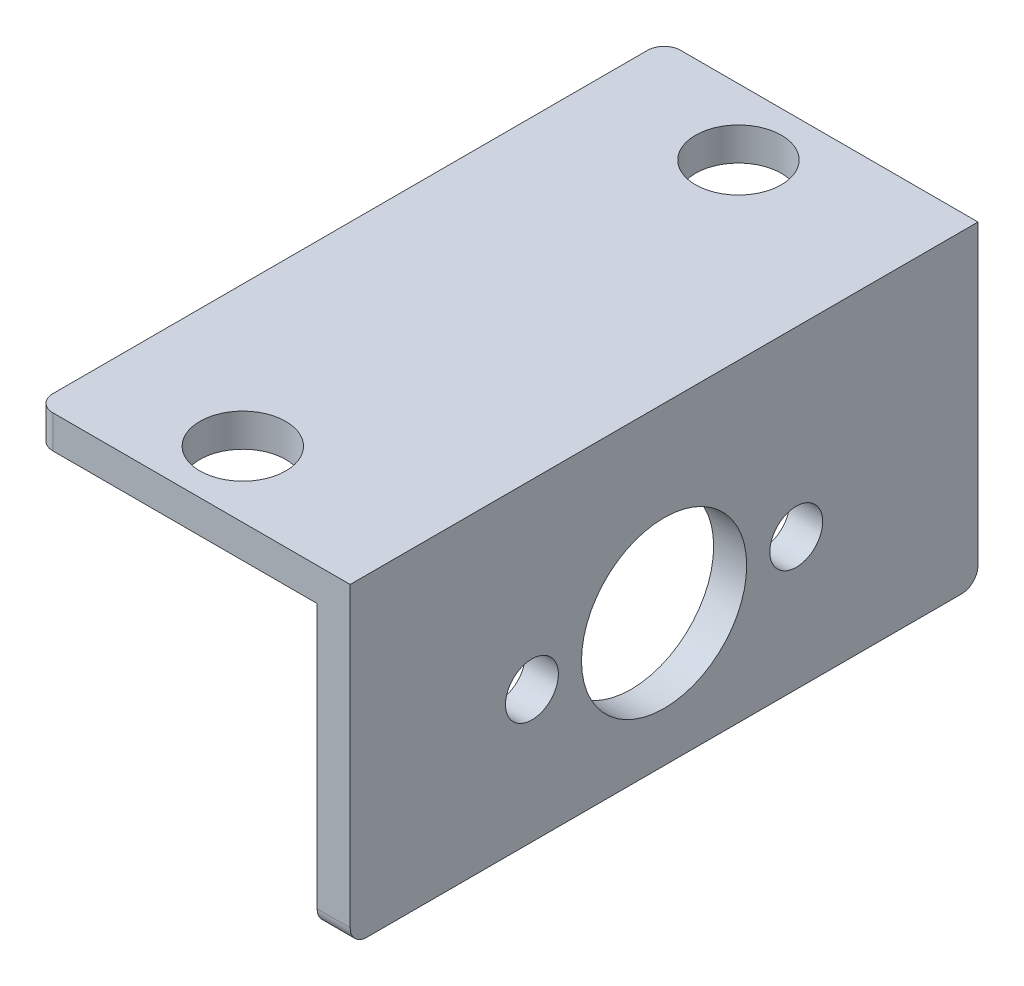
ISO-10303-21;
HEADER;
FILE_DESCRIPTION(('STEP AP214'),'2;1');
FILE_NAME('part.step','',(''),(''),'','','');
FILE_SCHEMA(('AUTOMOTIVE_DESIGN { 1 0 10303 214 1 1 1 1 }'));
ENDSEC;
DATA;
#1=APPLICATION_CONTEXT('core data for automotive mechanical design processes');
#2=APPLICATION_PROTOCOL_DEFINITION('international standard','automotive_design',2000,#1);
#3=PRODUCT_CONTEXT('',#1,'mechanical');
#4=PRODUCT('Part','Part','',(#3));
#5=PRODUCT_RELATED_PRODUCT_CATEGORY('part','',(#4));
#6=PRODUCT_DEFINITION_FORMATION('','',#4);
#7=PRODUCT_DEFINITION_CONTEXT('part definition',#1,'design');
#8=PRODUCT_DEFINITION('design','',#6,#7);
#9=PRODUCT_DEFINITION_SHAPE('','',#8);
#10=(LENGTH_UNIT() NAMED_UNIT(*) SI_UNIT(.MILLI.,.METRE.));
#11=(NAMED_UNIT(*) PLANE_ANGLE_UNIT() SI_UNIT($,.RADIAN.));
#12=(NAMED_UNIT(*) SI_UNIT($,.STERADIAN.) SOLID_ANGLE_UNIT());
#13=UNCERTAINTY_MEASURE_WITH_UNIT(LENGTH_MEASURE(1.E-05),#10,'distance_accuracy_value','');
#14=(GEOMETRIC_REPRESENTATION_CONTEXT(3) GLOBAL_UNCERTAINTY_ASSIGNED_CONTEXT((#13)) GLOBAL_UNIT_ASSIGNED_CONTEXT((#10,
#11,#12)) REPRESENTATION_CONTEXT('',''));
#15=CARTESIAN_POINT('',(0.,0.,0.));
#16=DIRECTION('',(0.,0.,1.));
#17=DIRECTION('',(1.,0.,0.));
#18=AXIS2_PLACEMENT_3D('',#15,#16,#17);
#19=CARTESIAN_POINT('',(-19.,0.,38.));
#20=DIRECTION('',(0.,-1.,0.));
#21=DIRECTION('',(0.,0.,-1.));
#22=AXIS2_PLACEMENT_3D('',#19,#20,#21);
#23=PLANE('',#22);
#24=CARTESIAN_POINT('',(-10.5,0.,4.));
#25=DIRECTION('',(0.,-1.,0.));
#26=DIRECTION('',(-1.,0.,0.));
#27=AXIS2_PLACEMENT_3D('',#24,#25,#26);
#28=CIRCLE('',#27,2.6);
#29=CARTESIAN_POINT('',(-13.1,0.,4.));
#30=VERTEX_POINT('',#29);
#31=EDGE_CURVE('E221',#30,#30,#28,.T.);
#32=ORIENTED_EDGE('',*,*,#31,.T.);
#33=EDGE_LOOP('',(#32));
#34=FACE_BOUND('',#33,.T.);
#35=CARTESIAN_POINT('',(-10.5,0.,34.));
#36=DIRECTION('',(0.,-1.,0.));
#37=DIRECTION('',(1.,0.,0.));
#38=AXIS2_PLACEMENT_3D('',#35,#36,#37);
#39=CIRCLE('',#38,2.6);
#40=CARTESIAN_POINT('',(-7.9,0.,34.));
#41=VERTEX_POINT('',#40);
#42=EDGE_CURVE('E215',#41,#41,#39,.T.);
#43=ORIENTED_EDGE('',*,*,#42,.T.);
#44=EDGE_LOOP('',(#43));
#45=FACE_BOUND('',#44,.T.);
#46=DIRECTION('',(0.,0.,-1.));
#47=VECTOR('',#46,1.);
#48=CARTESIAN_POINT('',(-19.,0.,38.));
#49=LINE('',#48,#47);
#50=CARTESIAN_POINT('',(-19.,0.,37.));
#51=VERTEX_POINT('',#50);
#52=CARTESIAN_POINT('',(-19.,0.,1.));
#53=VERTEX_POINT('',#52);
#54=EDGE_CURVE('E162',#51,#53,#49,.T.);
#55=ORIENTED_EDGE('',*,*,#54,.F.);
#56=CARTESIAN_POINT('',(-18.,0.,37.));
#57=DIRECTION('',(0.,-1.,0.));
#58=DIRECTION('',(0.,0.,-1.));
#59=AXIS2_PLACEMENT_3D('',#56,#57,#58);
#60=CIRCLE('',#59,1.);
#61=CARTESIAN_POINT('',(-18.,0.,38.));
#62=VERTEX_POINT('',#61);
#63=EDGE_CURVE('E11',#51,#62,#60,.F.);
#64=ORIENTED_EDGE('',*,*,#63,.T.);
#65=DIRECTION('',(-1.,0.,0.));
#66=VECTOR('',#65,1.);
#67=CARTESIAN_POINT('',(-19.,0.,38.));
#68=LINE('',#67,#66);
#69=CARTESIAN_POINT('',(0.,0.,38.));
#70=VERTEX_POINT('',#69);
#71=EDGE_CURVE('E122',#70,#62,#68,.T.);
#72=ORIENTED_EDGE('',*,*,#71,.F.);
#73=DIRECTION('',(0.,0.,-1.));
#74=VECTOR('',#73,1.);
#75=CARTESIAN_POINT('',(0.,0.,38.));
#76=LINE('',#75,#74);
#77=CARTESIAN_POINT('',(0.,0.,0.));
#78=VERTEX_POINT('',#77);
#79=EDGE_CURVE('E141',#70,#78,#76,.T.);
#80=ORIENTED_EDGE('',*,*,#79,.T.);
#81=DIRECTION('',(-1.,0.,0.));
#82=VECTOR('',#81,1.);
#83=CARTESIAN_POINT('',(-19.,0.,0.));
#84=LINE('',#83,#82);
#85=CARTESIAN_POINT('',(-18.,0.,0.));
#86=VERTEX_POINT('',#85);
#87=EDGE_CURVE('E145',#78,#86,#84,.T.);
#88=ORIENTED_EDGE('',*,*,#87,.T.);
#89=CARTESIAN_POINT('',(-18.,0.,1.));
#90=DIRECTION('',(0.,-1.,0.));
#91=DIRECTION('',(0.,0.,-1.));
#92=AXIS2_PLACEMENT_3D('',#89,#90,#91);
#93=CIRCLE('',#92,1.);
#94=EDGE_CURVE('E41',#86,#53,#93,.F.);
#95=ORIENTED_EDGE('',*,*,#94,.T.);
#96=EDGE_LOOP('',(#55,#64,#72,#80,#88,#95));
#97=FACE_BOUND('',#96,.T.);
#98=ADVANCED_FACE('F33',(#34,#45,#97),#23,.F.);
#99=CARTESIAN_POINT('',(-19.,-2.,38.));
#100=DIRECTION('',(1.,0.,0.));
#101=DIRECTION('',(0.,0.,-1.));
#102=AXIS2_PLACEMENT_3D('',#99,#100,#101);
#103=PLANE('',#102);
#104=DIRECTION('',(0.,0.,-1.));
#105=VECTOR('',#104,1.);
#106=CARTESIAN_POINT('',(-19.,-2.,38.));
#107=LINE('',#106,#105);
#108=CARTESIAN_POINT('',(-19.,-2.,37.));
#109=VERTEX_POINT('',#108);
#110=CARTESIAN_POINT('',(-19.,-2.,1.));
#111=VERTEX_POINT('',#110);
#112=EDGE_CURVE('E132',#109,#111,#107,.T.);
#113=ORIENTED_EDGE('',*,*,#112,.F.);
#114=DIRECTION('',(0.,-1.,0.));
#115=VECTOR('',#114,1.);
#116=CARTESIAN_POINT('',(-19.,-2.,37.));
#117=LINE('',#116,#115);
#118=EDGE_CURVE('E54',#109,#51,#117,.F.);
#119=ORIENTED_EDGE('',*,*,#118,.T.);
#120=ORIENTED_EDGE('',*,*,#54,.T.);
#121=DIRECTION('',(0.,-1.,0.));
#122=VECTOR('',#121,1.);
#123=CARTESIAN_POINT('',(-19.,-2.,1.));
#124=LINE('',#123,#122);
#125=EDGE_CURVE('E187',#53,#111,#124,.T.);
#126=ORIENTED_EDGE('',*,*,#125,.T.);
#127=EDGE_LOOP('',(#113,#119,#120,#126));
#128=FACE_BOUND('',#127,.T.);
#129=ADVANCED_FACE('F191',(#128),#103,.F.);
#130=CARTESIAN_POINT('',(-2.,-2.,38.));
#131=DIRECTION('',(0.,1.,0.));
#132=DIRECTION('',(-1.,0.,0.));
#133=AXIS2_PLACEMENT_3D('',#130,#131,#132);
#134=PLANE('',#133);
#135=CARTESIAN_POINT('',(-10.5,-2.,4.));
#136=DIRECTION('',(0.,-1.,0.));
#137=DIRECTION('',(-1.,0.,0.));
#138=AXIS2_PLACEMENT_3D('',#135,#136,#137);
#139=CIRCLE('',#138,2.6);
#140=CARTESIAN_POINT('',(-13.1,-2.,4.));
#141=VERTEX_POINT('',#140);
#142=EDGE_CURVE('E224',#141,#141,#139,.T.);
#143=ORIENTED_EDGE('',*,*,#142,.F.);
#144=EDGE_LOOP('',(#143));
#145=FACE_BOUND('',#144,.T.);
#146=CARTESIAN_POINT('',(-10.5,-2.,34.));
#147=DIRECTION('',(0.,-1.,0.));
#148=DIRECTION('',(1.,0.,0.));
#149=AXIS2_PLACEMENT_3D('',#146,#147,#148);
#150=CIRCLE('',#149,2.6);
#151=CARTESIAN_POINT('',(-7.9,-2.,34.));
#152=VERTEX_POINT('',#151);
#153=EDGE_CURVE('E218',#152,#152,#150,.T.);
#154=ORIENTED_EDGE('',*,*,#153,.F.);
#155=EDGE_LOOP('',(#154));
#156=FACE_BOUND('',#155,.T.);
#157=DIRECTION('',(1.,0.,0.));
#158=VECTOR('',#157,1.);
#159=CARTESIAN_POINT('',(-2.,-2.,38.));
#160=LINE('',#159,#158);
#161=CARTESIAN_POINT('',(-18.,-2.,38.));
#162=VERTEX_POINT('',#161);
#163=CARTESIAN_POINT('',(-2.,-2.,38.));
#164=VERTEX_POINT('',#163);
#165=EDGE_CURVE('E111',#162,#164,#160,.T.);
#166=ORIENTED_EDGE('',*,*,#165,.F.);
#167=CARTESIAN_POINT('',(-18.,-2.,37.));
#168=DIRECTION('',(0.,1.,0.));
#169=DIRECTION('',(-1.,0.,0.));
#170=AXIS2_PLACEMENT_3D('',#167,#168,#169);
#171=CIRCLE('',#170,1.);
#172=EDGE_CURVE('E185',#162,#109,#171,.F.);
#173=ORIENTED_EDGE('',*,*,#172,.T.);
#174=ORIENTED_EDGE('',*,*,#112,.T.);
#175=CARTESIAN_POINT('',(-18.,-2.,1.));
#176=DIRECTION('',(0.,1.,0.));
#177=DIRECTION('',(-1.,0.,0.));
#178=AXIS2_PLACEMENT_3D('',#175,#176,#177);
#179=CIRCLE('',#178,1.);
#180=CARTESIAN_POINT('',(-18.,-2.,0.));
#181=VERTEX_POINT('',#180);
#182=EDGE_CURVE('E183',#111,#181,#179,.F.);
#183=ORIENTED_EDGE('',*,*,#182,.T.);
#184=DIRECTION('',(1.,0.,0.));
#185=VECTOR('',#184,1.);
#186=CARTESIAN_POINT('',(-2.,-2.,0.));
#187=LINE('',#186,#185);
#188=CARTESIAN_POINT('',(-2.,-2.,0.));
#189=VERTEX_POINT('',#188);
#190=EDGE_CURVE('E128',#181,#189,#187,.T.);
#191=ORIENTED_EDGE('',*,*,#190,.T.);
#192=DIRECTION('',(0.,0.,-1.));
#193=VECTOR('',#192,1.);
#194=CARTESIAN_POINT('',(-2.,-2.,38.));
#195=LINE('',#194,#193);
#196=EDGE_CURVE('E125',#164,#189,#195,.T.);
#197=ORIENTED_EDGE('',*,*,#196,.F.);
#198=EDGE_LOOP('',(#166,#173,#174,#183,#191,#197));
#199=FACE_BOUND('',#198,.T.);
#200=ADVANCED_FACE('F126',(#145,#156,#199),#134,.F.);
#201=CARTESIAN_POINT('',(-2.,-19.,38.));
#202=DIRECTION('',(1.,0.,0.));
#203=DIRECTION('',(0.,0.,-1.));
#204=AXIS2_PLACEMENT_3D('',#201,#202,#203);
#205=PLANE('',#204);
#206=CARTESIAN_POINT('',(-2.,-11.,27.));
#207=DIRECTION('',(1.,0.,0.));
#208=DIRECTION('',(0.,0.,-1.));
#209=AXIS2_PLACEMENT_3D('',#206,#207,#208);
#210=CIRCLE('',#209,1.6);
#211=CARTESIAN_POINT('',(-2.,-11.,25.4));
#212=VERTEX_POINT('',#211);
#213=EDGE_CURVE('E205',#212,#212,#210,.T.);
#214=ORIENTED_EDGE('',*,*,#213,.T.);
#215=EDGE_LOOP('',(#214));
#216=FACE_BOUND('',#215,.T.);
#217=CARTESIAN_POINT('',(-2.,-11.,11.));
#218=DIRECTION('',(1.,0.,0.));
#219=DIRECTION('',(0.,0.,-1.));
#220=AXIS2_PLACEMENT_3D('',#217,#218,#219);
#221=CIRCLE('',#220,1.6);
#222=CARTESIAN_POINT('',(-2.,-11.,9.4));
#223=VERTEX_POINT('',#222);
#224=EDGE_CURVE('E208',#223,#223,#221,.T.);
#225=ORIENTED_EDGE('',*,*,#224,.T.);
#226=EDGE_LOOP('',(#225));
#227=FACE_BOUND('',#226,.T.);
#228=CARTESIAN_POINT('',(-2.,-11.,19.));
#229=DIRECTION('',(1.,0.,0.));
#230=DIRECTION('',(0.,0.,-1.));
#231=AXIS2_PLACEMENT_3D('',#228,#229,#230);
#232=CIRCLE('',#231,5.);
#233=CARTESIAN_POINT('',(-2.,-11.,14.));
#234=VERTEX_POINT('',#233);
#235=EDGE_CURVE('E147',#234,#234,#232,.T.);
#236=ORIENTED_EDGE('',*,*,#235,.T.);
#237=EDGE_LOOP('',(#236));
#238=FACE_BOUND('',#237,.T.);
#239=DIRECTION('',(0.,-1.,0.));
#240=VECTOR('',#239,1.);
#241=CARTESIAN_POINT('',(-2.,-19.,0.));
#242=LINE('',#241,#240);
#243=CARTESIAN_POINT('',(-2.,-18.,0.));
#244=VERTEX_POINT('',#243);
#245=EDGE_CURVE('E149',#189,#244,#242,.T.);
#246=ORIENTED_EDGE('',*,*,#245,.T.);
#247=CARTESIAN_POINT('',(-2.,-18.,1.));
#248=DIRECTION('',(1.,0.,0.));
#249=DIRECTION('',(0.,0.,-1.));
#250=AXIS2_PLACEMENT_3D('',#247,#248,#249);
#251=CIRCLE('',#250,1.);
#252=CARTESIAN_POINT('',(-2.,-19.,1.));
#253=VERTEX_POINT('',#252);
#254=EDGE_CURVE('E178',#244,#253,#251,.F.);
#255=ORIENTED_EDGE('',*,*,#254,.T.);
#256=DIRECTION('',(0.,0.,-1.));
#257=VECTOR('',#256,1.);
#258=CARTESIAN_POINT('',(-2.,-19.,38.));
#259=LINE('',#258,#257);
#260=CARTESIAN_POINT('',(-2.,-19.,37.));
#261=VERTEX_POINT('',#260);
#262=EDGE_CURVE('E133',#261,#253,#259,.T.);
#263=ORIENTED_EDGE('',*,*,#262,.F.);
#264=CARTESIAN_POINT('',(-2.,-18.,37.));
#265=DIRECTION('',(1.,0.,0.));
#266=DIRECTION('',(0.,0.,-1.));
#267=AXIS2_PLACEMENT_3D('',#264,#265,#266);
#268=CIRCLE('',#267,1.);
#269=CARTESIAN_POINT('',(-2.,-18.,38.));
#270=VERTEX_POINT('',#269);
#271=EDGE_CURVE('E138',#261,#270,#268,.F.);
#272=ORIENTED_EDGE('',*,*,#271,.T.);
#273=DIRECTION('',(0.,-1.,0.));
#274=VECTOR('',#273,1.);
#275=CARTESIAN_POINT('',(-2.,-19.,38.));
#276=LINE('',#275,#274);
#277=EDGE_CURVE('E116',#164,#270,#276,.T.);
#278=ORIENTED_EDGE('',*,*,#277,.F.);
#279=ORIENTED_EDGE('',*,*,#196,.T.);
#280=EDGE_LOOP('',(#246,#255,#263,#272,#278,#279));
#281=FACE_BOUND('',#280,.T.);
#282=ADVANCED_FACE('F135',(#216,#227,#238,#281),#205,.F.);
#283=CARTESIAN_POINT('',(0.,-19.,38.));
#284=DIRECTION('',(0.,1.,0.));
#285=DIRECTION('',(0.,0.,1.));
#286=AXIS2_PLACEMENT_3D('',#283,#284,#285);
#287=PLANE('',#286);
#288=ORIENTED_EDGE('',*,*,#262,.T.);
#289=DIRECTION('',(1.,0.,0.));
#290=VECTOR('',#289,1.);
#291=CARTESIAN_POINT('',(0.,-19.,1.));
#292=LINE('',#291,#290);
#293=CARTESIAN_POINT('',(0.,-19.,1.));
#294=VERTEX_POINT('',#293);
#295=EDGE_CURVE('E166',#253,#294,#292,.T.);
#296=ORIENTED_EDGE('',*,*,#295,.T.);
#297=DIRECTION('',(0.,0.,-1.));
#298=VECTOR('',#297,1.);
#299=CARTESIAN_POINT('',(0.,-19.,38.));
#300=LINE('',#299,#298);
#301=CARTESIAN_POINT('',(0.,-19.,37.));
#302=VERTEX_POINT('',#301);
#303=EDGE_CURVE('E155',#302,#294,#300,.T.);
#304=ORIENTED_EDGE('',*,*,#303,.F.);
#305=DIRECTION('',(1.,0.,0.));
#306=VECTOR('',#305,1.);
#307=CARTESIAN_POINT('',(0.,-19.,37.));
#308=LINE('',#307,#306);
#309=EDGE_CURVE('E164',#302,#261,#308,.F.);
#310=ORIENTED_EDGE('',*,*,#309,.T.);
#311=EDGE_LOOP('',(#288,#296,#304,#310));
#312=FACE_BOUND('',#311,.T.);
#313=ADVANCED_FACE('F287',(#312),#287,.F.);
#314=CARTESIAN_POINT('',(0.,0.,38.));
#315=DIRECTION('',(-1.,0.,0.));
#316=DIRECTION('',(0.,-1.,0.));
#317=AXIS2_PLACEMENT_3D('',#314,#315,#316);
#318=PLANE('',#317);
#319=CARTESIAN_POINT('',(0.,-11.,27.));
#320=DIRECTION('',(1.,0.,0.));
#321=DIRECTION('',(0.,1.,0.));
#322=AXIS2_PLACEMENT_3D('',#319,#320,#321);
#323=CIRCLE('',#322,1.6);
#324=CARTESIAN_POINT('',(0.,-9.39999999999999,27.));
#325=VERTEX_POINT('',#324);
#326=EDGE_CURVE('E211',#325,#325,#323,.T.);
#327=ORIENTED_EDGE('',*,*,#326,.F.);
#328=EDGE_LOOP('',(#327));
#329=FACE_BOUND('',#328,.T.);
#330=CARTESIAN_POINT('',(0.,-11.,11.));
#331=DIRECTION('',(1.,0.,0.));
#332=DIRECTION('',(0.,-1.,0.));
#333=AXIS2_PLACEMENT_3D('',#330,#331,#332);
#334=CIRCLE('',#333,1.6);
#335=CARTESIAN_POINT('',(0.,-12.6,11.));
#336=VERTEX_POINT('',#335);
#337=EDGE_CURVE('E212',#336,#336,#334,.T.);
#338=ORIENTED_EDGE('',*,*,#337,.F.);
#339=EDGE_LOOP('',(#338));
#340=FACE_BOUND('',#339,.T.);
#341=CARTESIAN_POINT('',(0.,-11.,19.));
#342=DIRECTION('',(1.,0.,0.));
#343=DIRECTION('',(0.,1.,0.));
#344=AXIS2_PLACEMENT_3D('',#341,#342,#343);
#345=CIRCLE('',#344,5.);
#346=CARTESIAN_POINT('',(0.,-6.,19.));
#347=VERTEX_POINT('',#346);
#348=EDGE_CURVE('E202',#347,#347,#345,.T.);
#349=ORIENTED_EDGE('',*,*,#348,.F.);
#350=EDGE_LOOP('',(#349));
#351=FACE_BOUND('',#350,.T.);
#352=ORIENTED_EDGE('',*,*,#303,.T.);
#353=CARTESIAN_POINT('',(0.,-18.,1.));
#354=DIRECTION('',(-1.,0.,0.));
#355=DIRECTION('',(0.,-1.,0.));
#356=AXIS2_PLACEMENT_3D('',#353,#354,#355);
#357=CIRCLE('',#356,1.);
#358=CARTESIAN_POINT('',(0.,-18.,0.));
#359=VERTEX_POINT('',#358);
#360=EDGE_CURVE('E171',#294,#359,#357,.F.);
#361=ORIENTED_EDGE('',*,*,#360,.T.);
#362=DIRECTION('',(0.,1.,0.));
#363=VECTOR('',#362,1.);
#364=CARTESIAN_POINT('',(0.,0.,0.));
#365=LINE('',#364,#363);
#366=EDGE_CURVE('E151',#359,#78,#365,.T.);
#367=ORIENTED_EDGE('',*,*,#366,.T.);
#368=ORIENTED_EDGE('',*,*,#79,.F.);
#369=DIRECTION('',(0.,1.,0.));
#370=VECTOR('',#369,1.);
#371=CARTESIAN_POINT('',(0.,0.,38.));
#372=LINE('',#371,#370);
#373=CARTESIAN_POINT('',(0.,-18.,38.));
#374=VERTEX_POINT('',#373);
#375=EDGE_CURVE('E139',#374,#70,#372,.T.);
#376=ORIENTED_EDGE('',*,*,#375,.F.);
#377=CARTESIAN_POINT('',(0.,-18.,37.));
#378=DIRECTION('',(-1.,0.,0.));
#379=DIRECTION('',(0.,-1.,0.));
#380=AXIS2_PLACEMENT_3D('',#377,#378,#379);
#381=CIRCLE('',#380,1.);
#382=EDGE_CURVE('E169',#374,#302,#381,.F.);
#383=ORIENTED_EDGE('',*,*,#382,.T.);
#384=EDGE_LOOP('',(#352,#361,#367,#368,#376,#383));
#385=FACE_BOUND('',#384,.T.);
#386=ADVANCED_FACE('F282',(#329,#340,#351,#385),#318,.F.);
#387=CARTESIAN_POINT('',(0.,0.,38.));
#388=DIRECTION('',(0.,0.,-1.));
#389=DIRECTION('',(-1.,0.,0.));
#390=AXIS2_PLACEMENT_3D('',#387,#388,#389);
#391=PLANE('',#390);
#392=ORIENTED_EDGE('',*,*,#277,.T.);
#393=DIRECTION('',(1.,0.,0.));
#394=VECTOR('',#393,1.);
#395=CARTESIAN_POINT('',(0.,-18.,38.));
#396=LINE('',#395,#394);
#397=EDGE_CURVE('E181',#270,#374,#396,.T.);
#398=ORIENTED_EDGE('',*,*,#397,.T.);
#399=ORIENTED_EDGE('',*,*,#375,.T.);
#400=ORIENTED_EDGE('',*,*,#71,.T.);
#401=DIRECTION('',(0.,-1.,0.));
#402=VECTOR('',#401,1.);
#403=CARTESIAN_POINT('',(-18.,0.,38.));
#404=LINE('',#403,#402);
#405=EDGE_CURVE('E120',#62,#162,#404,.T.);
#406=ORIENTED_EDGE('',*,*,#405,.T.);
#407=ORIENTED_EDGE('',*,*,#165,.T.);
#408=EDGE_LOOP('',(#392,#398,#399,#400,#406,#407));
#409=FACE_BOUND('',#408,.T.);
#410=ADVANCED_FACE('F113',(#409),#391,.F.);
#411=CARTESIAN_POINT('',(0.,0.,0.));
#412=DIRECTION('',(0.,0.,-1.));
#413=DIRECTION('',(-1.,0.,0.));
#414=AXIS2_PLACEMENT_3D('',#411,#412,#413);
#415=PLANE('',#414);
#416=ORIENTED_EDGE('',*,*,#366,.F.);
#417=DIRECTION('',(1.,0.,0.));
#418=VECTOR('',#417,1.);
#419=CARTESIAN_POINT('',(-2.,-18.,0.));
#420=LINE('',#419,#418);
#421=EDGE_CURVE('E175',#359,#244,#420,.F.);
#422=ORIENTED_EDGE('',*,*,#421,.T.);
#423=ORIENTED_EDGE('',*,*,#245,.F.);
#424=ORIENTED_EDGE('',*,*,#190,.F.);
#425=DIRECTION('',(0.,-1.,0.));
#426=VECTOR('',#425,1.);
#427=CARTESIAN_POINT('',(-18.,0.,0.));
#428=LINE('',#427,#426);
#429=EDGE_CURVE('E173',#181,#86,#428,.F.);
#430=ORIENTED_EDGE('',*,*,#429,.T.);
#431=ORIENTED_EDGE('',*,*,#87,.F.);
#432=EDGE_LOOP('',(#416,#422,#423,#424,#430,#431));
#433=FACE_BOUND('',#432,.T.);
#434=ADVANCED_FACE('F280',(#433),#415,.T.);
#435=CARTESIAN_POINT('',(-19.,-11.,19.));
#436=DIRECTION('',(1.,0.,0.));
#437=DIRECTION('',(0.,1.,0.));
#438=AXIS2_PLACEMENT_3D('',#435,#436,#437);
#439=CYLINDRICAL_SURFACE('',#438,5.);
#440=ORIENTED_EDGE('',*,*,#348,.T.);
#441=EDGE_LOOP('',(#440));
#442=FACE_BOUND('',#441,.T.);
#443=ORIENTED_EDGE('',*,*,#235,.F.);
#444=EDGE_LOOP('',(#443));
#445=FACE_BOUND('',#444,.T.);
#446=ADVANCED_FACE('F303',(#442,#445),#439,.F.);
#447=CARTESIAN_POINT('',(-19.,-11.,11.));
#448=DIRECTION('',(1.,0.,0.));
#449=DIRECTION('',(0.,1.,0.));
#450=AXIS2_PLACEMENT_3D('',#447,#448,#449);
#451=CYLINDRICAL_SURFACE('',#450,1.6);
#452=ORIENTED_EDGE('',*,*,#337,.T.);
#453=EDGE_LOOP('',(#452));
#454=FACE_BOUND('',#453,.T.);
#455=ORIENTED_EDGE('',*,*,#224,.F.);
#456=EDGE_LOOP('',(#455));
#457=FACE_BOUND('',#456,.T.);
#458=ADVANCED_FACE('F252',(#454,#457),#451,.F.);
#459=CARTESIAN_POINT('',(-19.,-11.,27.));
#460=DIRECTION('',(1.,0.,0.));
#461=DIRECTION('',(0.,1.,0.));
#462=AXIS2_PLACEMENT_3D('',#459,#460,#461);
#463=CYLINDRICAL_SURFACE('',#462,1.6);
#464=ORIENTED_EDGE('',*,*,#326,.T.);
#465=EDGE_LOOP('',(#464));
#466=FACE_BOUND('',#465,.T.);
#467=ORIENTED_EDGE('',*,*,#213,.F.);
#468=EDGE_LOOP('',(#467));
#469=FACE_BOUND('',#468,.T.);
#470=ADVANCED_FACE('F246',(#466,#469),#463,.F.);
#471=CARTESIAN_POINT('',(-10.5,0.,34.));
#472=DIRECTION('',(0.,-1.,0.));
#473=DIRECTION('',(1.,0.,0.));
#474=AXIS2_PLACEMENT_3D('',#471,#472,#473);
#475=CYLINDRICAL_SURFACE('',#474,2.6);
#476=ORIENTED_EDGE('',*,*,#42,.F.);
#477=EDGE_LOOP('',(#476));
#478=FACE_BOUND('',#477,.T.);
#479=ORIENTED_EDGE('',*,*,#153,.T.);
#480=EDGE_LOOP('',(#479));
#481=FACE_BOUND('',#480,.T.);
#482=ADVANCED_FACE('F236',(#478,#481),#475,.F.);
#483=CARTESIAN_POINT('',(-10.5,0.,4.));
#484=DIRECTION('',(0.,-1.,0.));
#485=DIRECTION('',(1.,0.,0.));
#486=AXIS2_PLACEMENT_3D('',#483,#484,#485);
#487=CYLINDRICAL_SURFACE('',#486,2.6);
#488=ORIENTED_EDGE('',*,*,#31,.F.);
#489=EDGE_LOOP('',(#488));
#490=FACE_BOUND('',#489,.T.);
#491=ORIENTED_EDGE('',*,*,#142,.T.);
#492=EDGE_LOOP('',(#491));
#493=FACE_BOUND('',#492,.T.);
#494=ADVANCED_FACE('F232',(#490,#493),#487,.F.);
#495=CARTESIAN_POINT('',(0.,-18.,1.));
#496=DIRECTION('',(-1.,0.,0.));
#497=DIRECTION('',(0.,0.,1.));
#498=AXIS2_PLACEMENT_3D('',#495,#496,#497);
#499=CYLINDRICAL_SURFACE('',#498,1.);
#500=ORIENTED_EDGE('',*,*,#254,.F.);
#501=ORIENTED_EDGE('',*,*,#421,.F.);
#502=ORIENTED_EDGE('',*,*,#360,.F.);
#503=ORIENTED_EDGE('',*,*,#295,.F.);
#504=EDGE_LOOP('',(#500,#501,#502,#503));
#505=FACE_BOUND('',#504,.T.);
#506=ADVANCED_FACE('F235',(#505),#499,.T.);
#507=CARTESIAN_POINT('',(0.,-18.,37.));
#508=DIRECTION('',(1.,0.,0.));
#509=DIRECTION('',(0.,0.,-1.));
#510=AXIS2_PLACEMENT_3D('',#507,#508,#509);
#511=CYLINDRICAL_SURFACE('',#510,1.);
#512=ORIENTED_EDGE('',*,*,#271,.F.);
#513=ORIENTED_EDGE('',*,*,#309,.F.);
#514=ORIENTED_EDGE('',*,*,#382,.F.);
#515=ORIENTED_EDGE('',*,*,#397,.F.);
#516=EDGE_LOOP('',(#512,#513,#514,#515));
#517=FACE_BOUND('',#516,.T.);
#518=ADVANCED_FACE('F266',(#517),#511,.T.);
#519=CARTESIAN_POINT('',(-18.,0.,37.));
#520=DIRECTION('',(0.,-1.,0.));
#521=DIRECTION('',(0.,0.,-1.));
#522=AXIS2_PLACEMENT_3D('',#519,#520,#521);
#523=CYLINDRICAL_SURFACE('',#522,1.);
#524=ORIENTED_EDGE('',*,*,#63,.F.);
#525=ORIENTED_EDGE('',*,*,#118,.F.);
#526=ORIENTED_EDGE('',*,*,#172,.F.);
#527=ORIENTED_EDGE('',*,*,#405,.F.);
#528=EDGE_LOOP('',(#524,#525,#526,#527));
#529=FACE_BOUND('',#528,.T.);
#530=ADVANCED_FACE('F195',(#529),#523,.T.);
#531=CARTESIAN_POINT('',(-18.,-2.,1.));
#532=DIRECTION('',(0.,1.,0.));
#533=DIRECTION('',(0.,0.,1.));
#534=AXIS2_PLACEMENT_3D('',#531,#532,#533);
#535=CYLINDRICAL_SURFACE('',#534,1.);
#536=ORIENTED_EDGE('',*,*,#94,.F.);
#537=ORIENTED_EDGE('',*,*,#429,.F.);
#538=ORIENTED_EDGE('',*,*,#182,.F.);
#539=ORIENTED_EDGE('',*,*,#125,.F.);
#540=EDGE_LOOP('',(#536,#537,#538,#539));
#541=FACE_BOUND('',#540,.T.);
#542=ADVANCED_FACE('F35',(#541),#535,.T.);
#543=CLOSED_SHELL('',(#98,#129,#200,#282,#313,#386,#410,#434,#446,#458,#470,#482,#494,#506,#518,
#530,#542));
#544=MANIFOLD_SOLID_BREP('B2',#543);
#545=ADVANCED_BREP_SHAPE_REPRESENTATION('',(#18,#544),#14);
#546=SHAPE_DEFINITION_REPRESENTATION(#9,#545);
ENDSEC;
END-ISO-10303-21;
